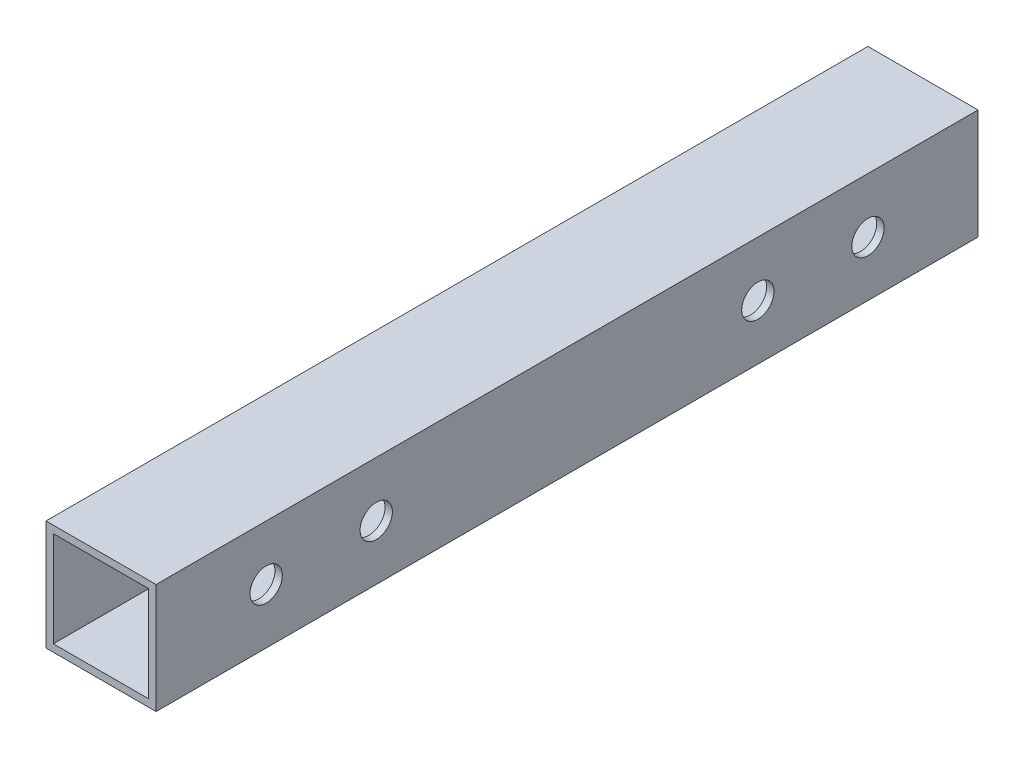
ISO-10303-21;
HEADER;
FILE_DESCRIPTION(('STEP AP214'),'2;1');
FILE_NAME('part.step','',(''),(''),'','','');
FILE_SCHEMA(('AUTOMOTIVE_DESIGN { 1 0 10303 214 1 1 1 1 }'));
ENDSEC;
DATA;
#1=APPLICATION_CONTEXT('core data for automotive mechanical design processes');
#2=APPLICATION_PROTOCOL_DEFINITION('international standard','automotive_design',2000,#1);
#3=PRODUCT_CONTEXT('',#1,'mechanical');
#4=PRODUCT('Part','Part','',(#3));
#5=PRODUCT_RELATED_PRODUCT_CATEGORY('part','',(#4));
#6=PRODUCT_DEFINITION_FORMATION('','',#4);
#7=PRODUCT_DEFINITION_CONTEXT('part definition',#1,'design');
#8=PRODUCT_DEFINITION('design','',#6,#7);
#9=PRODUCT_DEFINITION_SHAPE('','',#8);
#10=(LENGTH_UNIT() NAMED_UNIT(*) SI_UNIT(.MILLI.,.METRE.));
#11=(NAMED_UNIT(*) PLANE_ANGLE_UNIT() SI_UNIT($,.RADIAN.));
#12=(NAMED_UNIT(*) SI_UNIT($,.STERADIAN.) SOLID_ANGLE_UNIT());
#13=UNCERTAINTY_MEASURE_WITH_UNIT(LENGTH_MEASURE(1.E-05),#10,'distance_accuracy_value','');
#14=(GEOMETRIC_REPRESENTATION_CONTEXT(3) GLOBAL_UNCERTAINTY_ASSIGNED_CONTEXT((#13)) GLOBAL_UNIT_ASSIGNED_CONTEXT((#10,
#11,#12)) REPRESENTATION_CONTEXT('',''));
#15=CARTESIAN_POINT('',(0.,0.,0.));
#16=DIRECTION('',(0.,0.,1.));
#17=DIRECTION('',(1.,0.,0.));
#18=AXIS2_PLACEMENT_3D('',#15,#16,#17);
#19=CARTESIAN_POINT('',(0.,0.,112.));
#20=DIRECTION('',(0.,0.,1.));
#21=DIRECTION('',(1.,0.,0.));
#22=AXIS2_PLACEMENT_3D('',#19,#20,#21);
#23=PLANE('',#22);
#24=DIRECTION('',(0.,1.,0.));
#25=VECTOR('',#24,1.);
#26=CARTESIAN_POINT('',(7.5,7.5,112.));
#27=LINE('',#26,#25);
#28=CARTESIAN_POINT('',(7.5,-7.5,112.));
#29=VERTEX_POINT('',#28);
#30=CARTESIAN_POINT('',(7.5,7.5,112.));
#31=VERTEX_POINT('',#30);
#32=EDGE_CURVE('E143',#29,#31,#27,.T.);
#33=ORIENTED_EDGE('',*,*,#32,.T.);
#34=DIRECTION('',(-1.,0.,0.));
#35=VECTOR('',#34,1.);
#36=CARTESIAN_POINT('',(-7.5,7.5,112.));
#37=LINE('',#36,#35);
#38=CARTESIAN_POINT('',(-7.5,7.5,112.));
#39=VERTEX_POINT('',#38);
#40=EDGE_CURVE('E146',#31,#39,#37,.T.);
#41=ORIENTED_EDGE('',*,*,#40,.T.);
#42=DIRECTION('',(0.,-1.,0.));
#43=VECTOR('',#42,1.);
#44=CARTESIAN_POINT('',(-7.5,7.5,112.));
#45=LINE('',#44,#43);
#46=CARTESIAN_POINT('',(-7.5,-7.5,112.));
#47=VERTEX_POINT('',#46);
#48=EDGE_CURVE('E149',#39,#47,#45,.T.);
#49=ORIENTED_EDGE('',*,*,#48,.T.);
#50=DIRECTION('',(1.,0.,0.));
#51=VECTOR('',#50,1.);
#52=CARTESIAN_POINT('',(-7.5,-7.5,112.));
#53=LINE('',#52,#51);
#54=EDGE_CURVE('E151',#47,#29,#53,.T.);
#55=ORIENTED_EDGE('',*,*,#54,.T.);
#56=EDGE_LOOP('',(#33,#41,#49,#55));
#57=FACE_BOUND('',#56,.T.);
#58=DIRECTION('',(-1.,0.,0.));
#59=VECTOR('',#58,1.);
#60=CARTESIAN_POINT('',(-6.49999999999999,6.5,112.));
#61=LINE('',#60,#59);
#62=CARTESIAN_POINT('',(6.5,6.5,112.));
#63=VERTEX_POINT('',#62);
#64=CARTESIAN_POINT('',(-6.49999999999999,6.5,112.));
#65=VERTEX_POINT('',#64);
#66=EDGE_CURVE('E113',#63,#65,#61,.T.);
#67=ORIENTED_EDGE('',*,*,#66,.F.);
#68=DIRECTION('',(0.,1.,0.));
#69=VECTOR('',#68,1.);
#70=CARTESIAN_POINT('',(6.5,6.5,112.));
#71=LINE('',#70,#69);
#72=CARTESIAN_POINT('',(6.5,-6.5,112.));
#73=VERTEX_POINT('',#72);
#74=EDGE_CURVE('E105',#73,#63,#71,.T.);
#75=ORIENTED_EDGE('',*,*,#74,.F.);
#76=DIRECTION('',(1.,0.,0.));
#77=VECTOR('',#76,1.);
#78=CARTESIAN_POINT('',(-6.49999999999999,-6.5,112.));
#79=LINE('',#78,#77);
#80=CARTESIAN_POINT('',(-6.49999999999999,-6.5,112.));
#81=VERTEX_POINT('',#80);
#82=EDGE_CURVE('E127',#81,#73,#79,.T.);
#83=ORIENTED_EDGE('',*,*,#82,.F.);
#84=DIRECTION('',(0.,-1.,0.));
#85=VECTOR('',#84,1.);
#86=CARTESIAN_POINT('',(-6.49999999999999,6.5,112.));
#87=LINE('',#86,#85);
#88=EDGE_CURVE('E125',#65,#81,#87,.T.);
#89=ORIENTED_EDGE('',*,*,#88,.F.);
#90=EDGE_LOOP('',(#67,#75,#83,#89));
#91=FACE_BOUND('',#90,.T.);
#92=ADVANCED_FACE('F38',(#57,#91),#23,.T.);
#93=CARTESIAN_POINT('',(0.,0.,0.));
#94=DIRECTION('',(0.,0.,1.));
#95=DIRECTION('',(1.,0.,0.));
#96=AXIS2_PLACEMENT_3D('',#93,#94,#95);
#97=PLANE('',#96);
#98=DIRECTION('',(0.,1.,0.));
#99=VECTOR('',#98,1.);
#100=CARTESIAN_POINT('',(7.5,7.5,0.));
#101=LINE('',#100,#99);
#102=CARTESIAN_POINT('',(7.5,-7.5,0.));
#103=VERTEX_POINT('',#102);
#104=CARTESIAN_POINT('',(7.5,7.5,0.));
#105=VERTEX_POINT('',#104);
#106=EDGE_CURVE('E121',#103,#105,#101,.T.);
#107=ORIENTED_EDGE('',*,*,#106,.F.);
#108=DIRECTION('',(1.,0.,0.));
#109=VECTOR('',#108,1.);
#110=CARTESIAN_POINT('',(-7.5,-7.5,0.));
#111=LINE('',#110,#109);
#112=CARTESIAN_POINT('',(-7.5,-7.5,0.));
#113=VERTEX_POINT('',#112);
#114=EDGE_CURVE('E147',#113,#103,#111,.T.);
#115=ORIENTED_EDGE('',*,*,#114,.F.);
#116=DIRECTION('',(0.,-1.,0.));
#117=VECTOR('',#116,1.);
#118=CARTESIAN_POINT('',(-7.5,7.5,0.));
#119=LINE('',#118,#117);
#120=CARTESIAN_POINT('',(-7.5,7.5,0.));
#121=VERTEX_POINT('',#120);
#122=EDGE_CURVE('E158',#121,#113,#119,.T.);
#123=ORIENTED_EDGE('',*,*,#122,.F.);
#124=DIRECTION('',(-1.,0.,0.));
#125=VECTOR('',#124,1.);
#126=CARTESIAN_POINT('',(-7.5,7.5,0.));
#127=LINE('',#126,#125);
#128=EDGE_CURVE('E156',#105,#121,#127,.T.);
#129=ORIENTED_EDGE('',*,*,#128,.F.);
#130=EDGE_LOOP('',(#107,#115,#123,#129));
#131=FACE_BOUND('',#130,.T.);
#132=DIRECTION('',(0.,1.,0.));
#133=VECTOR('',#132,1.);
#134=CARTESIAN_POINT('',(6.5,6.5,0.));
#135=LINE('',#134,#133);
#136=CARTESIAN_POINT('',(6.5,-6.5,0.));
#137=VERTEX_POINT('',#136);
#138=CARTESIAN_POINT('',(6.5,6.5,0.));
#139=VERTEX_POINT('',#138);
#140=EDGE_CURVE('E63',#137,#139,#135,.T.);
#141=ORIENTED_EDGE('',*,*,#140,.T.);
#142=DIRECTION('',(-1.,0.,0.));
#143=VECTOR('',#142,1.);
#144=CARTESIAN_POINT('',(-6.49999999999999,6.5,0.));
#145=LINE('',#144,#143);
#146=CARTESIAN_POINT('',(-6.49999999999999,6.5,0.));
#147=VERTEX_POINT('',#146);
#148=EDGE_CURVE('E120',#139,#147,#145,.T.);
#149=ORIENTED_EDGE('',*,*,#148,.T.);
#150=DIRECTION('',(0.,-1.,0.));
#151=VECTOR('',#150,1.);
#152=CARTESIAN_POINT('',(-6.49999999999999,6.5,0.));
#153=LINE('',#152,#151);
#154=CARTESIAN_POINT('',(-6.49999999999999,-6.5,0.));
#155=VERTEX_POINT('',#154);
#156=EDGE_CURVE('E135',#147,#155,#153,.T.);
#157=ORIENTED_EDGE('',*,*,#156,.T.);
#158=DIRECTION('',(1.,0.,0.));
#159=VECTOR('',#158,1.);
#160=CARTESIAN_POINT('',(-6.49999999999999,-6.5,0.));
#161=LINE('',#160,#159);
#162=EDGE_CURVE('E114',#155,#137,#161,.T.);
#163=ORIENTED_EDGE('',*,*,#162,.T.);
#164=EDGE_LOOP('',(#141,#149,#157,#163));
#165=FACE_BOUND('',#164,.T.);
#166=ADVANCED_FACE('F226',(#131,#165),#97,.F.);
#167=CARTESIAN_POINT('',(7.5,7.5,112.));
#168=DIRECTION('',(-1.,0.,0.));
#169=DIRECTION('',(0.,-1.,0.));
#170=AXIS2_PLACEMENT_3D('',#167,#168,#169);
#171=PLANE('',#170);
#172=CARTESIAN_POINT('',(7.5,0.,15.));
#173=DIRECTION('',(1.,0.,0.));
#174=DIRECTION('',(0.,1.,0.));
#175=AXIS2_PLACEMENT_3D('',#172,#173,#174);
#176=CIRCLE('',#175,2.2);
#177=CARTESIAN_POINT('',(7.5,2.2,15.));
#178=VERTEX_POINT('',#177);
#179=EDGE_CURVE('E172',#178,#178,#176,.T.);
#180=ORIENTED_EDGE('',*,*,#179,.F.);
#181=EDGE_LOOP('',(#180));
#182=FACE_BOUND('',#181,.T.);
#183=CARTESIAN_POINT('',(7.5,0.,82.));
#184=DIRECTION('',(1.,0.,0.));
#185=DIRECTION('',(0.,-1.,0.));
#186=AXIS2_PLACEMENT_3D('',#183,#184,#185);
#187=CIRCLE('',#186,2.2);
#188=CARTESIAN_POINT('',(7.5,-2.2,82.));
#189=VERTEX_POINT('',#188);
#190=EDGE_CURVE('E297',#189,#189,#187,.T.);
#191=ORIENTED_EDGE('',*,*,#190,.F.);
#192=EDGE_LOOP('',(#191));
#193=FACE_BOUND('',#192,.T.);
#194=CARTESIAN_POINT('',(7.5,0.,97.));
#195=DIRECTION('',(1.,0.,0.));
#196=DIRECTION('',(0.,-1.,0.));
#197=AXIS2_PLACEMENT_3D('',#194,#195,#196);
#198=CIRCLE('',#197,2.2);
#199=CARTESIAN_POINT('',(7.5,-2.20000000000001,97.));
#200=VERTEX_POINT('',#199);
#201=EDGE_CURVE('E293',#200,#200,#198,.T.);
#202=ORIENTED_EDGE('',*,*,#201,.F.);
#203=EDGE_LOOP('',(#202));
#204=FACE_BOUND('',#203,.T.);
#205=CARTESIAN_POINT('',(7.5,0.,30.));
#206=DIRECTION('',(1.,0.,0.));
#207=DIRECTION('',(0.,1.,0.));
#208=AXIS2_PLACEMENT_3D('',#205,#206,#207);
#209=CIRCLE('',#208,2.2);
#210=CARTESIAN_POINT('',(7.5,2.2,30.));
#211=VERTEX_POINT('',#210);
#212=EDGE_CURVE('E296',#211,#211,#209,.T.);
#213=ORIENTED_EDGE('',*,*,#212,.F.);
#214=EDGE_LOOP('',(#213));
#215=FACE_BOUND('',#214,.T.);
#216=ORIENTED_EDGE('',*,*,#106,.T.);
#217=DIRECTION('',(0.,0.,-1.));
#218=VECTOR('',#217,1.);
#219=CARTESIAN_POINT('',(7.5,7.5,112.));
#220=LINE('',#219,#218);
#221=EDGE_CURVE('E11',#31,#105,#220,.T.);
#222=ORIENTED_EDGE('',*,*,#221,.F.);
#223=ORIENTED_EDGE('',*,*,#32,.F.);
#224=DIRECTION('',(0.,0.,-1.));
#225=VECTOR('',#224,1.);
#226=CARTESIAN_POINT('',(7.5,-7.5,112.));
#227=LINE('',#226,#225);
#228=EDGE_CURVE('E153',#29,#103,#227,.T.);
#229=ORIENTED_EDGE('',*,*,#228,.T.);
#230=EDGE_LOOP('',(#216,#222,#223,#229));
#231=FACE_BOUND('',#230,.T.);
#232=ADVANCED_FACE('F40',(#182,#193,#204,#215,#231),#171,.F.);
#233=CARTESIAN_POINT('',(-7.5,7.5,112.));
#234=DIRECTION('',(0.,-1.,0.));
#235=DIRECTION('',(0.,0.,-1.));
#236=AXIS2_PLACEMENT_3D('',#233,#234,#235);
#237=PLANE('',#236);
#238=ORIENTED_EDGE('',*,*,#128,.T.);
#239=DIRECTION('',(0.,0.,-1.));
#240=VECTOR('',#239,1.);
#241=CARTESIAN_POINT('',(-7.5,7.5,112.));
#242=LINE('',#241,#240);
#243=EDGE_CURVE('E47',#39,#121,#242,.T.);
#244=ORIENTED_EDGE('',*,*,#243,.F.);
#245=ORIENTED_EDGE('',*,*,#40,.F.);
#246=ORIENTED_EDGE('',*,*,#221,.T.);
#247=EDGE_LOOP('',(#238,#244,#245,#246));
#248=FACE_BOUND('',#247,.T.);
#249=ADVANCED_FACE('F242',(#248),#237,.F.);
#250=CARTESIAN_POINT('',(-7.5,7.5,112.));
#251=DIRECTION('',(1.,0.,0.));
#252=DIRECTION('',(0.,0.,-1.));
#253=AXIS2_PLACEMENT_3D('',#250,#251,#252);
#254=PLANE('',#253);
#255=CARTESIAN_POINT('',(-7.5,0.,15.));
#256=DIRECTION('',(1.,0.,0.));
#257=DIRECTION('',(0.,0.,-1.));
#258=AXIS2_PLACEMENT_3D('',#255,#256,#257);
#259=CIRCLE('',#258,2.2);
#260=CARTESIAN_POINT('',(-7.5,0.,12.8));
#261=VERTEX_POINT('',#260);
#262=EDGE_CURVE('E133',#261,#261,#259,.T.);
#263=ORIENTED_EDGE('',*,*,#262,.T.);
#264=EDGE_LOOP('',(#263));
#265=FACE_BOUND('',#264,.T.);
#266=CARTESIAN_POINT('',(-7.5,0.,82.));
#267=DIRECTION('',(1.,0.,0.));
#268=DIRECTION('',(0.,0.,-1.));
#269=AXIS2_PLACEMENT_3D('',#266,#267,#268);
#270=CIRCLE('',#269,2.2);
#271=CARTESIAN_POINT('',(-7.5,0.,79.8));
#272=VERTEX_POINT('',#271);
#273=EDGE_CURVE('E184',#272,#272,#270,.T.);
#274=ORIENTED_EDGE('',*,*,#273,.T.);
#275=EDGE_LOOP('',(#274));
#276=FACE_BOUND('',#275,.T.);
#277=CARTESIAN_POINT('',(-7.5,0.,97.));
#278=DIRECTION('',(1.,0.,0.));
#279=DIRECTION('',(0.,0.,-1.));
#280=AXIS2_PLACEMENT_3D('',#277,#278,#279);
#281=CIRCLE('',#280,2.2);
#282=CARTESIAN_POINT('',(-7.5,0.,94.8));
#283=VERTEX_POINT('',#282);
#284=EDGE_CURVE('E180',#283,#283,#281,.T.);
#285=ORIENTED_EDGE('',*,*,#284,.T.);
#286=EDGE_LOOP('',(#285));
#287=FACE_BOUND('',#286,.T.);
#288=CARTESIAN_POINT('',(-7.5,0.,30.));
#289=DIRECTION('',(1.,0.,0.));
#290=DIRECTION('',(0.,0.,-1.));
#291=AXIS2_PLACEMENT_3D('',#288,#289,#290);
#292=CIRCLE('',#291,2.2);
#293=CARTESIAN_POINT('',(-7.5,0.,27.8));
#294=VERTEX_POINT('',#293);
#295=EDGE_CURVE('E176',#294,#294,#292,.T.);
#296=ORIENTED_EDGE('',*,*,#295,.T.);
#297=EDGE_LOOP('',(#296));
#298=FACE_BOUND('',#297,.T.);
#299=ORIENTED_EDGE('',*,*,#122,.T.);
#300=DIRECTION('',(0.,0.,-1.));
#301=VECTOR('',#300,1.);
#302=CARTESIAN_POINT('',(-7.5,-7.5,112.));
#303=LINE('',#302,#301);
#304=EDGE_CURVE('E163',#47,#113,#303,.T.);
#305=ORIENTED_EDGE('',*,*,#304,.F.);
#306=ORIENTED_EDGE('',*,*,#48,.F.);
#307=ORIENTED_EDGE('',*,*,#243,.T.);
#308=EDGE_LOOP('',(#299,#305,#306,#307));
#309=FACE_BOUND('',#308,.T.);
#310=ADVANCED_FACE('F201',(#265,#276,#287,#298,#309),#254,.F.);
#311=CARTESIAN_POINT('',(-7.5,-7.5,112.));
#312=DIRECTION('',(0.,1.,0.));
#313=DIRECTION('',(0.,0.,1.));
#314=AXIS2_PLACEMENT_3D('',#311,#312,#313);
#315=PLANE('',#314);
#316=ORIENTED_EDGE('',*,*,#114,.T.);
#317=ORIENTED_EDGE('',*,*,#228,.F.);
#318=ORIENTED_EDGE('',*,*,#54,.F.);
#319=ORIENTED_EDGE('',*,*,#304,.T.);
#320=EDGE_LOOP('',(#316,#317,#318,#319));
#321=FACE_BOUND('',#320,.T.);
#322=ADVANCED_FACE('F237',(#321),#315,.F.);
#323=CARTESIAN_POINT('',(6.5,6.5,112.));
#324=DIRECTION('',(-1.,0.,0.));
#325=DIRECTION('',(0.,0.,1.));
#326=AXIS2_PLACEMENT_3D('',#323,#324,#325);
#327=PLANE('',#326);
#328=CARTESIAN_POINT('',(6.5,0.,15.));
#329=DIRECTION('',(-1.,0.,0.));
#330=DIRECTION('',(0.,0.,1.));
#331=AXIS2_PLACEMENT_3D('',#328,#329,#330);
#332=CIRCLE('',#331,2.2);
#333=CARTESIAN_POINT('',(6.5,0.,17.2));
#334=VERTEX_POINT('',#333);
#335=EDGE_CURVE('E196',#334,#334,#332,.T.);
#336=ORIENTED_EDGE('',*,*,#335,.F.);
#337=EDGE_LOOP('',(#336));
#338=FACE_BOUND('',#337,.T.);
#339=CARTESIAN_POINT('',(6.5,0.,82.));
#340=DIRECTION('',(-1.,0.,0.));
#341=DIRECTION('',(0.,0.,1.));
#342=AXIS2_PLACEMENT_3D('',#339,#340,#341);
#343=CIRCLE('',#342,2.2);
#344=CARTESIAN_POINT('',(6.5,0.,84.2));
#345=VERTEX_POINT('',#344);
#346=EDGE_CURVE('E179',#345,#345,#343,.T.);
#347=ORIENTED_EDGE('',*,*,#346,.F.);
#348=EDGE_LOOP('',(#347));
#349=FACE_BOUND('',#348,.T.);
#350=CARTESIAN_POINT('',(6.5,0.,97.));
#351=DIRECTION('',(-1.,0.,0.));
#352=DIRECTION('',(0.,0.,1.));
#353=AXIS2_PLACEMENT_3D('',#350,#351,#352);
#354=CIRCLE('',#353,2.2);
#355=CARTESIAN_POINT('',(6.5,0.,99.2));
#356=VERTEX_POINT('',#355);
#357=EDGE_CURVE('E175',#356,#356,#354,.T.);
#358=ORIENTED_EDGE('',*,*,#357,.F.);
#359=EDGE_LOOP('',(#358));
#360=FACE_BOUND('',#359,.T.);
#361=CARTESIAN_POINT('',(6.5,0.,30.));
#362=DIRECTION('',(-1.,0.,0.));
#363=DIRECTION('',(0.,0.,1.));
#364=AXIS2_PLACEMENT_3D('',#361,#362,#363);
#365=CIRCLE('',#364,2.2);
#366=CARTESIAN_POINT('',(6.5,0.,32.2));
#367=VERTEX_POINT('',#366);
#368=EDGE_CURVE('E171',#367,#367,#365,.T.);
#369=ORIENTED_EDGE('',*,*,#368,.F.);
#370=EDGE_LOOP('',(#369));
#371=FACE_BOUND('',#370,.T.);
#372=ORIENTED_EDGE('',*,*,#140,.F.);
#373=DIRECTION('',(0.,0.,-1.));
#374=VECTOR('',#373,1.);
#375=CARTESIAN_POINT('',(6.5,-6.5,112.));
#376=LINE('',#375,#374);
#377=EDGE_CURVE('E109',#73,#137,#376,.T.);
#378=ORIENTED_EDGE('',*,*,#377,.F.);
#379=ORIENTED_EDGE('',*,*,#74,.T.);
#380=DIRECTION('',(0.,0.,-1.));
#381=VECTOR('',#380,1.);
#382=CARTESIAN_POINT('',(6.5,6.5,112.));
#383=LINE('',#382,#381);
#384=EDGE_CURVE('E108',#63,#139,#383,.T.);
#385=ORIENTED_EDGE('',*,*,#384,.T.);
#386=EDGE_LOOP('',(#372,#378,#379,#385));
#387=FACE_BOUND('',#386,.T.);
#388=ADVANCED_FACE('F107',(#338,#349,#360,#371,#387),#327,.T.);
#389=CARTESIAN_POINT('',(-6.49999999999999,6.5,112.));
#390=DIRECTION('',(0.,-1.,0.));
#391=DIRECTION('',(0.,0.,-1.));
#392=AXIS2_PLACEMENT_3D('',#389,#390,#391);
#393=PLANE('',#392);
#394=ORIENTED_EDGE('',*,*,#148,.F.);
#395=ORIENTED_EDGE('',*,*,#384,.F.);
#396=ORIENTED_EDGE('',*,*,#66,.T.);
#397=DIRECTION('',(0.,0.,-1.));
#398=VECTOR('',#397,1.);
#399=CARTESIAN_POINT('',(-6.49999999999999,6.5,112.));
#400=LINE('',#399,#398);
#401=EDGE_CURVE('E122',#65,#147,#400,.T.);
#402=ORIENTED_EDGE('',*,*,#401,.T.);
#403=EDGE_LOOP('',(#394,#395,#396,#402));
#404=FACE_BOUND('',#403,.T.);
#405=ADVANCED_FACE('F117',(#404),#393,.T.);
#406=CARTESIAN_POINT('',(-6.49999999999999,6.5,112.));
#407=DIRECTION('',(1.,0.,0.));
#408=DIRECTION('',(0.,0.,-1.));
#409=AXIS2_PLACEMENT_3D('',#406,#407,#408);
#410=PLANE('',#409);
#411=CARTESIAN_POINT('',(-6.49999999999999,0.,15.));
#412=DIRECTION('',(1.,0.,0.));
#413=DIRECTION('',(0.,0.,-1.));
#414=AXIS2_PLACEMENT_3D('',#411,#412,#413);
#415=CIRCLE('',#414,2.2);
#416=CARTESIAN_POINT('',(-6.49999999999999,0.,12.8));
#417=VERTEX_POINT('',#416);
#418=EDGE_CURVE('E42',#417,#417,#415,.T.);
#419=ORIENTED_EDGE('',*,*,#418,.F.);
#420=EDGE_LOOP('',(#419));
#421=FACE_BOUND('',#420,.T.);
#422=CARTESIAN_POINT('',(-6.49999999999999,0.,82.));
#423=DIRECTION('',(1.,0.,0.));
#424=DIRECTION('',(0.,0.,-1.));
#425=AXIS2_PLACEMENT_3D('',#422,#423,#424);
#426=CIRCLE('',#425,2.2);
#427=CARTESIAN_POINT('',(-6.49999999999999,0.,79.8));
#428=VERTEX_POINT('',#427);
#429=EDGE_CURVE('E177',#428,#428,#426,.T.);
#430=ORIENTED_EDGE('',*,*,#429,.F.);
#431=EDGE_LOOP('',(#430));
#432=FACE_BOUND('',#431,.T.);
#433=CARTESIAN_POINT('',(-6.49999999999999,0.,97.));
#434=DIRECTION('',(1.,0.,0.));
#435=DIRECTION('',(0.,0.,-1.));
#436=AXIS2_PLACEMENT_3D('',#433,#434,#435);
#437=CIRCLE('',#436,2.2);
#438=CARTESIAN_POINT('',(-6.49999999999999,0.,94.8));
#439=VERTEX_POINT('',#438);
#440=EDGE_CURVE('E173',#439,#439,#437,.T.);
#441=ORIENTED_EDGE('',*,*,#440,.F.);
#442=EDGE_LOOP('',(#441));
#443=FACE_BOUND('',#442,.T.);
#444=CARTESIAN_POINT('',(-6.49999999999999,0.,30.));
#445=DIRECTION('',(1.,0.,0.));
#446=DIRECTION('',(0.,0.,-1.));
#447=AXIS2_PLACEMENT_3D('',#444,#445,#446);
#448=CIRCLE('',#447,2.2);
#449=CARTESIAN_POINT('',(-6.49999999999999,0.,27.8));
#450=VERTEX_POINT('',#449);
#451=EDGE_CURVE('E168',#450,#450,#448,.T.);
#452=ORIENTED_EDGE('',*,*,#451,.F.);
#453=EDGE_LOOP('',(#452));
#454=FACE_BOUND('',#453,.T.);
#455=ORIENTED_EDGE('',*,*,#156,.F.);
#456=ORIENTED_EDGE('',*,*,#401,.F.);
#457=ORIENTED_EDGE('',*,*,#88,.T.);
#458=DIRECTION('',(0.,0.,-1.));
#459=VECTOR('',#458,1.);
#460=CARTESIAN_POINT('',(-6.49999999999999,-6.5,112.));
#461=LINE('',#460,#459);
#462=EDGE_CURVE('E55',#81,#155,#461,.T.);
#463=ORIENTED_EDGE('',*,*,#462,.T.);
#464=EDGE_LOOP('',(#455,#456,#457,#463));
#465=FACE_BOUND('',#464,.T.);
#466=ADVANCED_FACE('F265',(#421,#432,#443,#454,#465),#410,.T.);
#467=CARTESIAN_POINT('',(-6.49999999999999,-6.5,112.));
#468=DIRECTION('',(0.,1.,0.));
#469=DIRECTION('',(0.,0.,1.));
#470=AXIS2_PLACEMENT_3D('',#467,#468,#469);
#471=PLANE('',#470);
#472=ORIENTED_EDGE('',*,*,#162,.F.);
#473=ORIENTED_EDGE('',*,*,#462,.F.);
#474=ORIENTED_EDGE('',*,*,#82,.T.);
#475=ORIENTED_EDGE('',*,*,#377,.T.);
#476=EDGE_LOOP('',(#472,#473,#474,#475));
#477=FACE_BOUND('',#476,.T.);
#478=ADVANCED_FACE('F263',(#477),#471,.T.);
#479=CARTESIAN_POINT('',(-47.5,0.,30.));
#480=DIRECTION('',(1.,0.,0.));
#481=DIRECTION('',(0.,1.,0.));
#482=AXIS2_PLACEMENT_3D('',#479,#480,#481);
#483=CYLINDRICAL_SURFACE('',#482,2.2);
#484=ORIENTED_EDGE('',*,*,#451,.T.);
#485=EDGE_LOOP('',(#484));
#486=FACE_BOUND('',#485,.T.);
#487=ORIENTED_EDGE('',*,*,#295,.F.);
#488=EDGE_LOOP('',(#487));
#489=FACE_BOUND('',#488,.T.);
#490=ADVANCED_FACE('F218',(#486,#489),#483,.F.);
#491=CARTESIAN_POINT('',(-47.5,0.,97.));
#492=DIRECTION('',(1.,0.,0.));
#493=DIRECTION('',(0.,1.,0.));
#494=AXIS2_PLACEMENT_3D('',#491,#492,#493);
#495=CYLINDRICAL_SURFACE('',#494,2.2);
#496=ORIENTED_EDGE('',*,*,#440,.T.);
#497=EDGE_LOOP('',(#496));
#498=FACE_BOUND('',#497,.T.);
#499=ORIENTED_EDGE('',*,*,#284,.F.);
#500=EDGE_LOOP('',(#499));
#501=FACE_BOUND('',#500,.T.);
#502=ADVANCED_FACE('F219',(#498,#501),#495,.F.);
#503=CARTESIAN_POINT('',(-47.5,0.,82.));
#504=DIRECTION('',(1.,0.,0.));
#505=DIRECTION('',(0.,1.,0.));
#506=AXIS2_PLACEMENT_3D('',#503,#504,#505);
#507=CYLINDRICAL_SURFACE('',#506,2.2);
#508=ORIENTED_EDGE('',*,*,#429,.T.);
#509=EDGE_LOOP('',(#508));
#510=FACE_BOUND('',#509,.T.);
#511=ORIENTED_EDGE('',*,*,#273,.F.);
#512=EDGE_LOOP('',(#511));
#513=FACE_BOUND('',#512,.T.);
#514=ADVANCED_FACE('F207',(#510,#513),#507,.F.);
#515=CARTESIAN_POINT('',(-47.5,0.,15.));
#516=DIRECTION('',(1.,0.,0.));
#517=DIRECTION('',(0.,1.,0.));
#518=AXIS2_PLACEMENT_3D('',#515,#516,#517);
#519=CYLINDRICAL_SURFACE('',#518,2.2);
#520=ORIENTED_EDGE('',*,*,#418,.T.);
#521=EDGE_LOOP('',(#520));
#522=FACE_BOUND('',#521,.T.);
#523=ORIENTED_EDGE('',*,*,#262,.F.);
#524=EDGE_LOOP('',(#523));
#525=FACE_BOUND('',#524,.T.);
#526=ADVANCED_FACE('F204',(#522,#525),#519,.F.);
#527=ORIENTED_EDGE('',*,*,#368,.T.);
#528=EDGE_LOOP('',(#527));
#529=FACE_BOUND('',#528,.T.);
#530=ORIENTED_EDGE('',*,*,#212,.T.);
#531=EDGE_LOOP('',(#530));
#532=FACE_BOUND('',#531,.T.);
#533=ADVANCED_FACE('F206',(#529,#532),#483,.F.);
#534=ORIENTED_EDGE('',*,*,#357,.T.);
#535=EDGE_LOOP('',(#534));
#536=FACE_BOUND('',#535,.T.);
#537=ORIENTED_EDGE('',*,*,#201,.T.);
#538=EDGE_LOOP('',(#537));
#539=FACE_BOUND('',#538,.T.);
#540=ADVANCED_FACE('F215',(#536,#539),#495,.F.);
#541=ORIENTED_EDGE('',*,*,#346,.T.);
#542=EDGE_LOOP('',(#541));
#543=FACE_BOUND('',#542,.T.);
#544=ORIENTED_EDGE('',*,*,#190,.T.);
#545=EDGE_LOOP('',(#544));
#546=FACE_BOUND('',#545,.T.);
#547=ADVANCED_FACE('F221',(#543,#546),#507,.F.);
#548=ORIENTED_EDGE('',*,*,#335,.T.);
#549=EDGE_LOOP('',(#548));
#550=FACE_BOUND('',#549,.T.);
#551=ORIENTED_EDGE('',*,*,#179,.T.);
#552=EDGE_LOOP('',(#551));
#553=FACE_BOUND('',#552,.T.);
#554=ADVANCED_FACE('F210',(#550,#553),#519,.F.);
#555=CLOSED_SHELL('',(#92,#166,#232,#249,#310,#322,#388,#405,#466,#478,#490,#502,#514,#526,#533,
#540,#547,#554));
#556=MANIFOLD_SOLID_BREP('B2',#555);
#557=ADVANCED_BREP_SHAPE_REPRESENTATION('',(#18,#556),#14);
#558=SHAPE_DEFINITION_REPRESENTATION(#9,#557);
ENDSEC;
END-ISO-10303-21;
